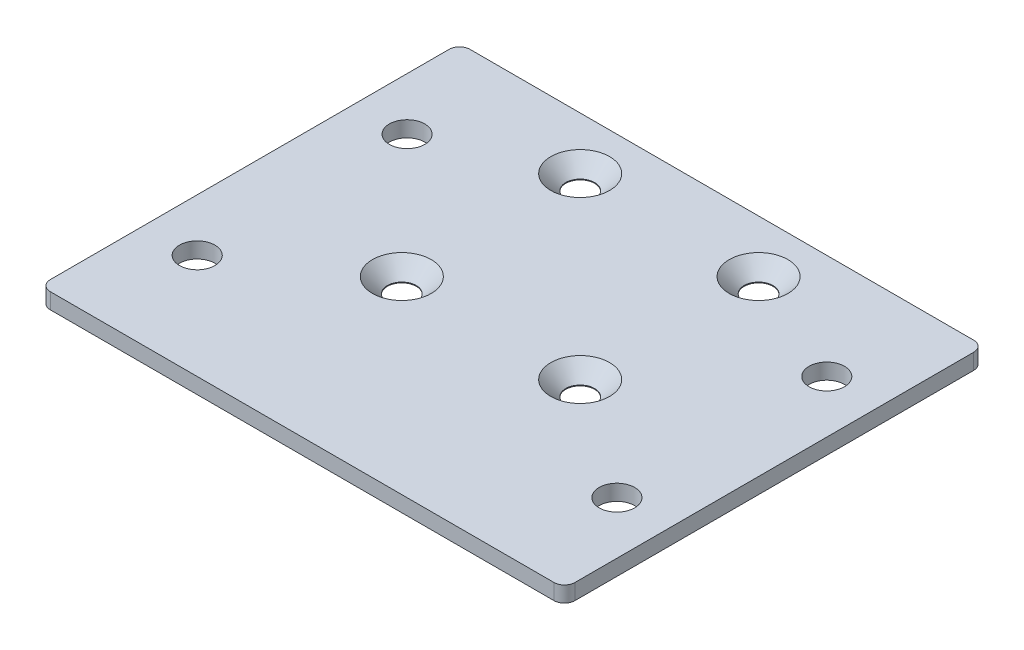
ISO-10303-21;
HEADER;
FILE_DESCRIPTION(('STEP AP214'),'2;1');
FILE_NAME('part.step','',(''),(''),'','','');
FILE_SCHEMA(('AUTOMOTIVE_DESIGN { 1 0 10303 214 1 1 1 1 }'));
ENDSEC;
DATA;
#1=APPLICATION_CONTEXT('core data for automotive mechanical design processes');
#2=APPLICATION_PROTOCOL_DEFINITION('international standard','automotive_design',2000,#1);
#3=PRODUCT_CONTEXT('',#1,'mechanical');
#4=PRODUCT('Part','Part','',(#3));
#5=PRODUCT_RELATED_PRODUCT_CATEGORY('part','',(#4));
#6=PRODUCT_DEFINITION_FORMATION('','',#4);
#7=PRODUCT_DEFINITION_CONTEXT('part definition',#1,'design');
#8=PRODUCT_DEFINITION('design','',#6,#7);
#9=PRODUCT_DEFINITION_SHAPE('','',#8);
#10=(LENGTH_UNIT() NAMED_UNIT(*) SI_UNIT(.MILLI.,.METRE.));
#11=(NAMED_UNIT(*) PLANE_ANGLE_UNIT() SI_UNIT($,.RADIAN.));
#12=(NAMED_UNIT(*) SI_UNIT($,.STERADIAN.) SOLID_ANGLE_UNIT());
#13=UNCERTAINTY_MEASURE_WITH_UNIT(LENGTH_MEASURE(1.E-05),#10,'distance_accuracy_value','');
#14=(GEOMETRIC_REPRESENTATION_CONTEXT(3) GLOBAL_UNCERTAINTY_ASSIGNED_CONTEXT((#13)) GLOBAL_UNIT_ASSIGNED_CONTEXT((#10,
#11,#12)) REPRESENTATION_CONTEXT('',''));
#15=CARTESIAN_POINT('',(0.,0.,0.));
#16=DIRECTION('',(0.,0.,1.));
#17=DIRECTION('',(1.,0.,0.));
#18=AXIS2_PLACEMENT_3D('',#15,#16,#17);
#19=CARTESIAN_POINT('',(-149.777777777778,-3.,-34.4444444444445));
#20=DIRECTION('',(-1.,0.,0.));
#21=DIRECTION('',(0.,0.,1.));
#22=AXIS2_PLACEMENT_3D('',#19,#20,#21);
#23=PLANE('',#22);
#24=DIRECTION('',(0.,0.,1.));
#25=VECTOR('',#24,1.);
#26=CARTESIAN_POINT('',(-149.777777777778,0.,-34.4444444444445));
#27=LINE('',#26,#25);
#28=CARTESIAN_POINT('',(-149.777777777778,0.,-32.4444444444445));
#29=VERTEX_POINT('',#28);
#30=CARTESIAN_POINT('',(-149.777777777778,0.,43.5555555555555));
#31=VERTEX_POINT('',#30);
#32=EDGE_CURVE('E166',#29,#31,#27,.T.);
#33=ORIENTED_EDGE('',*,*,#32,.F.);
#34=DIRECTION('',(0.,1.,0.));
#35=VECTOR('',#34,1.);
#36=CARTESIAN_POINT('',(-149.777777777778,-3.,-32.4444444444445));
#37=LINE('',#36,#35);
#38=CARTESIAN_POINT('',(-149.777777777778,-3.,-32.4444444444445));
#39=VERTEX_POINT('',#38);
#40=EDGE_CURVE('E146',#29,#39,#37,.F.);
#41=ORIENTED_EDGE('',*,*,#40,.T.);
#42=DIRECTION('',(0.,0.,1.));
#43=VECTOR('',#42,1.);
#44=CARTESIAN_POINT('',(-149.777777777778,-3.,-34.4444444444445));
#45=LINE('',#44,#43);
#46=CARTESIAN_POINT('',(-149.777777777778,-3.,43.5555555555555));
#47=VERTEX_POINT('',#46);
#48=EDGE_CURVE('E127',#39,#47,#45,.T.);
#49=ORIENTED_EDGE('',*,*,#48,.T.);
#50=DIRECTION('',(0.,1.,0.));
#51=VECTOR('',#50,1.);
#52=CARTESIAN_POINT('',(-149.777777777778,-3.,43.5555555555555));
#53=LINE('',#52,#51);
#54=EDGE_CURVE('E143',#47,#31,#53,.T.);
#55=ORIENTED_EDGE('',*,*,#54,.T.);
#56=EDGE_LOOP('',(#33,#41,#49,#55));
#57=FACE_BOUND('',#56,.T.);
#58=ADVANCED_FACE('F40',(#57),#23,.T.);
#59=CARTESIAN_POINT('',(-149.777777777778,-3.,-34.4444444444445));
#60=DIRECTION('',(0.,0.,-1.));
#61=DIRECTION('',(-1.,0.,0.));
#62=AXIS2_PLACEMENT_3D('',#59,#60,#61);
#63=PLANE('',#62);
#64=DIRECTION('',(-1.,0.,0.));
#65=VECTOR('',#64,1.);
#66=CARTESIAN_POINT('',(-149.777777777778,-3.,-34.4444444444445));
#67=LINE('',#66,#65);
#68=CARTESIAN_POINT('',(-51.7777777777778,-3.,-34.4444444444445));
#69=VERTEX_POINT('',#68);
#70=CARTESIAN_POINT('',(-147.777777777778,-3.,-34.4444444444445));
#71=VERTEX_POINT('',#70);
#72=EDGE_CURVE('E132',#69,#71,#67,.T.);
#73=ORIENTED_EDGE('',*,*,#72,.T.);
#74=DIRECTION('',(0.,1.,0.));
#75=VECTOR('',#74,1.);
#76=CARTESIAN_POINT('',(-147.777777777778,-3.,-34.4444444444445));
#77=LINE('',#76,#75);
#78=CARTESIAN_POINT('',(-147.777777777778,0.,-34.4444444444445));
#79=VERTEX_POINT('',#78);
#80=EDGE_CURVE('E126',#71,#79,#77,.T.);
#81=ORIENTED_EDGE('',*,*,#80,.T.);
#82=DIRECTION('',(-1.,0.,0.));
#83=VECTOR('',#82,1.);
#84=CARTESIAN_POINT('',(-149.777777777778,0.,-34.4444444444445));
#85=LINE('',#84,#83);
#86=CARTESIAN_POINT('',(-51.7777777777778,0.,-34.4444444444445));
#87=VERTEX_POINT('',#86);
#88=EDGE_CURVE('E109',#87,#79,#85,.T.);
#89=ORIENTED_EDGE('',*,*,#88,.F.);
#90=DIRECTION('',(0.,1.,0.));
#91=VECTOR('',#90,1.);
#92=CARTESIAN_POINT('',(-51.7777777777778,-3.,-34.4444444444445));
#93=LINE('',#92,#91);
#94=EDGE_CURVE('E123',#87,#69,#93,.F.);
#95=ORIENTED_EDGE('',*,*,#94,.T.);
#96=EDGE_LOOP('',(#73,#81,#89,#95));
#97=FACE_BOUND('',#96,.T.);
#98=ADVANCED_FACE('F122',(#97),#63,.T.);
#99=CARTESIAN_POINT('',(-49.7777777777778,-3.,-34.4444444444445));
#100=DIRECTION('',(1.,0.,0.));
#101=DIRECTION('',(0.,0.,-1.));
#102=AXIS2_PLACEMENT_3D('',#99,#100,#101);
#103=PLANE('',#102);
#104=DIRECTION('',(0.,0.,-1.));
#105=VECTOR('',#104,1.);
#106=CARTESIAN_POINT('',(-49.7777777777778,-3.,-34.4444444444445));
#107=LINE('',#106,#105);
#108=CARTESIAN_POINT('',(-49.7777777777777,-3.,43.5555555555555));
#109=VERTEX_POINT('',#108);
#110=CARTESIAN_POINT('',(-49.7777777777778,-3.,-32.4444444444445));
#111=VERTEX_POINT('',#110);
#112=EDGE_CURVE('E136',#109,#111,#107,.T.);
#113=ORIENTED_EDGE('',*,*,#112,.T.);
#114=DIRECTION('',(0.,1.,0.));
#115=VECTOR('',#114,1.);
#116=CARTESIAN_POINT('',(-49.7777777777778,-3.,-32.4444444444445));
#117=LINE('',#116,#115);
#118=CARTESIAN_POINT('',(-49.7777777777778,0.,-32.4444444444445));
#119=VERTEX_POINT('',#118);
#120=EDGE_CURVE('E156',#111,#119,#117,.T.);
#121=ORIENTED_EDGE('',*,*,#120,.T.);
#122=DIRECTION('',(0.,0.,-1.));
#123=VECTOR('',#122,1.);
#124=CARTESIAN_POINT('',(-49.7777777777778,0.,-34.4444444444445));
#125=LINE('',#124,#123);
#126=CARTESIAN_POINT('',(-49.7777777777777,0.,43.5555555555555));
#127=VERTEX_POINT('',#126);
#128=EDGE_CURVE('E111',#127,#119,#125,.T.);
#129=ORIENTED_EDGE('',*,*,#128,.F.);
#130=DIRECTION('',(0.,1.,0.));
#131=VECTOR('',#130,1.);
#132=CARTESIAN_POINT('',(-49.7777777777777,-3.,43.5555555555555));
#133=LINE('',#132,#131);
#134=EDGE_CURVE('E154',#127,#109,#133,.F.);
#135=ORIENTED_EDGE('',*,*,#134,.T.);
#136=EDGE_LOOP('',(#113,#121,#129,#135));
#137=FACE_BOUND('',#136,.T.);
#138=ADVANCED_FACE('F159',(#137),#103,.T.);
#139=CARTESIAN_POINT('',(-149.777777777778,-3.,45.5555555555555));
#140=DIRECTION('',(0.,0.,1.));
#141=DIRECTION('',(1.,0.,0.));
#142=AXIS2_PLACEMENT_3D('',#139,#140,#141);
#143=PLANE('',#142);
#144=DIRECTION('',(1.,0.,0.));
#145=VECTOR('',#144,1.);
#146=CARTESIAN_POINT('',(-149.777777777778,-3.,45.5555555555555));
#147=LINE('',#146,#145);
#148=CARTESIAN_POINT('',(-147.777777777778,-3.,45.5555555555555));
#149=VERTEX_POINT('',#148);
#150=CARTESIAN_POINT('',(-51.7777777777777,-3.,45.5555555555555));
#151=VERTEX_POINT('',#150);
#152=EDGE_CURVE('E161',#149,#151,#147,.T.);
#153=ORIENTED_EDGE('',*,*,#152,.T.);
#154=DIRECTION('',(0.,1.,0.));
#155=VECTOR('',#154,1.);
#156=CARTESIAN_POINT('',(-51.7777777777777,-3.,45.5555555555555));
#157=LINE('',#156,#155);
#158=CARTESIAN_POINT('',(-51.7777777777777,0.,45.5555555555555));
#159=VERTEX_POINT('',#158);
#160=EDGE_CURVE('E11',#151,#159,#157,.T.);
#161=ORIENTED_EDGE('',*,*,#160,.T.);
#162=DIRECTION('',(1.,0.,0.));
#163=VECTOR('',#162,1.);
#164=CARTESIAN_POINT('',(-149.777777777778,0.,45.5555555555555));
#165=LINE('',#164,#163);
#166=CARTESIAN_POINT('',(-147.777777777778,0.,45.5555555555555));
#167=VERTEX_POINT('',#166);
#168=EDGE_CURVE('E169',#167,#159,#165,.T.);
#169=ORIENTED_EDGE('',*,*,#168,.F.);
#170=DIRECTION('',(0.,1.,0.));
#171=VECTOR('',#170,1.);
#172=CARTESIAN_POINT('',(-147.777777777778,-3.,45.5555555555555));
#173=LINE('',#172,#171);
#174=EDGE_CURVE('E48',#167,#149,#173,.F.);
#175=ORIENTED_EDGE('',*,*,#174,.T.);
#176=EDGE_LOOP('',(#153,#161,#169,#175));
#177=FACE_BOUND('',#176,.T.);
#178=ADVANCED_FACE('F172',(#177),#143,.T.);
#179=CARTESIAN_POINT('',(0.,-3.,0.));
#180=DIRECTION('',(0.,1.,0.));
#181=DIRECTION('',(0.,0.,1.));
#182=AXIS2_PLACEMENT_3D('',#179,#180,#181);
#183=PLANE('',#182);
#184=CARTESIAN_POINT('',(-116.777777777778,-3.,-24.4444444444445));
#185=DIRECTION('',(0.,1.,0.));
#186=DIRECTION('',(0.,0.,1.));
#187=AXIS2_PLACEMENT_3D('',#184,#185,#186);
#188=CIRCLE('',#187,2.75);
#189=CARTESIAN_POINT('',(-116.777777777778,-3.,-21.6944444444445));
#190=VERTEX_POINT('',#189);
#191=EDGE_CURVE('E235',#190,#190,#188,.T.);
#192=ORIENTED_EDGE('',*,*,#191,.T.);
#193=EDGE_LOOP('',(#192));
#194=FACE_BOUND('',#193,.T.);
#195=CARTESIAN_POINT('',(-82.7777777777778,-3.,-24.4444444444445));
#196=DIRECTION('',(0.,1.,0.));
#197=DIRECTION('',(0.,0.,1.));
#198=AXIS2_PLACEMENT_3D('',#195,#196,#197);
#199=CIRCLE('',#198,2.75);
#200=CARTESIAN_POINT('',(-82.7777777777778,-3.,-21.6944444444445));
#201=VERTEX_POINT('',#200);
#202=EDGE_CURVE('E226',#201,#201,#199,.T.);
#203=ORIENTED_EDGE('',*,*,#202,.T.);
#204=EDGE_LOOP('',(#203));
#205=FACE_BOUND('',#204,.T.);
#206=CARTESIAN_POINT('',(-82.7777777777778,-3.,9.55555555555555));
#207=DIRECTION('',(0.,1.,0.));
#208=DIRECTION('',(0.,0.,1.));
#209=AXIS2_PLACEMENT_3D('',#206,#207,#208);
#210=CIRCLE('',#209,2.75);
#211=CARTESIAN_POINT('',(-82.7777777777778,-3.,12.3055555555555));
#212=VERTEX_POINT('',#211);
#213=EDGE_CURVE('E217',#212,#212,#210,.T.);
#214=ORIENTED_EDGE('',*,*,#213,.T.);
#215=EDGE_LOOP('',(#214));
#216=FACE_BOUND('',#215,.T.);
#217=CARTESIAN_POINT('',(-116.777777777778,-3.,9.55555555555555));
#218=DIRECTION('',(0.,1.,0.));
#219=DIRECTION('',(0.,0.,1.));
#220=AXIS2_PLACEMENT_3D('',#217,#218,#219);
#221=CIRCLE('',#220,2.75);
#222=CARTESIAN_POINT('',(-116.777777777778,-3.,12.3055555555555));
#223=VERTEX_POINT('',#222);
#224=EDGE_CURVE('E208',#223,#223,#221,.T.);
#225=ORIENTED_EDGE('',*,*,#224,.T.);
#226=EDGE_LOOP('',(#225));
#227=FACE_BOUND('',#226,.T.);
#228=CARTESIAN_POINT('',(-139.777777777778,-3.,25.5555555555555));
#229=DIRECTION('',(0.,1.,0.));
#230=DIRECTION('',(0.,0.,1.));
#231=AXIS2_PLACEMENT_3D('',#228,#229,#230);
#232=CIRCLE('',#231,3.3782);
#233=CARTESIAN_POINT('',(-139.777777777778,-3.,28.9337555555555));
#234=VERTEX_POINT('',#233);
#235=EDGE_CURVE('E202',#234,#234,#232,.T.);
#236=ORIENTED_EDGE('',*,*,#235,.T.);
#237=EDGE_LOOP('',(#236));
#238=FACE_BOUND('',#237,.T.);
#239=CARTESIAN_POINT('',(-59.7777777777778,-3.,25.5555555555555));
#240=DIRECTION('',(0.,1.,0.));
#241=DIRECTION('',(0.,0.,1.));
#242=AXIS2_PLACEMENT_3D('',#239,#240,#241);
#243=CIRCLE('',#242,3.3782);
#244=CARTESIAN_POINT('',(-59.7777777777778,-3.,28.9337555555555));
#245=VERTEX_POINT('',#244);
#246=EDGE_CURVE('E196',#245,#245,#243,.T.);
#247=ORIENTED_EDGE('',*,*,#246,.T.);
#248=EDGE_LOOP('',(#247));
#249=FACE_BOUND('',#248,.T.);
#250=CARTESIAN_POINT('',(-139.777777777778,-3.,-14.4444444444445));
#251=DIRECTION('',(0.,1.,0.));
#252=DIRECTION('',(0.,0.,1.));
#253=AXIS2_PLACEMENT_3D('',#250,#251,#252);
#254=CIRCLE('',#253,3.3782);
#255=CARTESIAN_POINT('',(-139.777777777778,-3.,-11.0662444444445));
#256=VERTEX_POINT('',#255);
#257=EDGE_CURVE('E190',#256,#256,#254,.T.);
#258=ORIENTED_EDGE('',*,*,#257,.T.);
#259=EDGE_LOOP('',(#258));
#260=FACE_BOUND('',#259,.T.);
#261=CARTESIAN_POINT('',(-59.7777777777778,-3.,-14.4444444444445));
#262=DIRECTION('',(0.,1.,0.));
#263=DIRECTION('',(0.,0.,1.));
#264=AXIS2_PLACEMENT_3D('',#261,#262,#263);
#265=CIRCLE('',#264,3.3782);
#266=CARTESIAN_POINT('',(-59.7777777777778,-3.,-11.0662444444445));
#267=VERTEX_POINT('',#266);
#268=EDGE_CURVE('E170',#267,#267,#265,.T.);
#269=ORIENTED_EDGE('',*,*,#268,.T.);
#270=EDGE_LOOP('',(#269));
#271=FACE_BOUND('',#270,.T.);
#272=ORIENTED_EDGE('',*,*,#48,.F.);
#273=CARTESIAN_POINT('',(-147.777777777778,-3.,-32.4444444444445));
#274=DIRECTION('',(0.,1.,0.));
#275=DIRECTION('',(0.,0.,1.));
#276=AXIS2_PLACEMENT_3D('',#273,#274,#275);
#277=CIRCLE('',#276,2.);
#278=EDGE_CURVE('E152',#39,#71,#277,.F.);
#279=ORIENTED_EDGE('',*,*,#278,.T.);
#280=ORIENTED_EDGE('',*,*,#72,.F.);
#281=CARTESIAN_POINT('',(-51.7777777777778,-3.,-32.4444444444445));
#282=DIRECTION('',(0.,1.,0.));
#283=DIRECTION('',(0.,0.,1.));
#284=AXIS2_PLACEMENT_3D('',#281,#282,#283);
#285=CIRCLE('',#284,2.);
#286=EDGE_CURVE('E131',#69,#111,#285,.F.);
#287=ORIENTED_EDGE('',*,*,#286,.T.);
#288=ORIENTED_EDGE('',*,*,#112,.F.);
#289=CARTESIAN_POINT('',(-51.7777777777777,-3.,43.5555555555555));
#290=DIRECTION('',(0.,1.,0.));
#291=DIRECTION('',(0.,0.,1.));
#292=AXIS2_PLACEMENT_3D('',#289,#290,#291);
#293=CIRCLE('',#292,2.);
#294=EDGE_CURVE('E55',#109,#151,#293,.F.);
#295=ORIENTED_EDGE('',*,*,#294,.T.);
#296=ORIENTED_EDGE('',*,*,#152,.F.);
#297=CARTESIAN_POINT('',(-147.777777777778,-3.,43.5555555555555));
#298=DIRECTION('',(0.,1.,0.));
#299=DIRECTION('',(0.,0.,1.));
#300=AXIS2_PLACEMENT_3D('',#297,#298,#299);
#301=CIRCLE('',#300,2.);
#302=EDGE_CURVE('E148',#149,#47,#301,.F.);
#303=ORIENTED_EDGE('',*,*,#302,.T.);
#304=EDGE_LOOP('',(#272,#279,#280,#287,#288,#295,#296,#303));
#305=FACE_BOUND('',#304,.T.);
#306=ADVANCED_FACE('F179',(#194,#205,#216,#227,#238,#249,#260,#271,#305),#183,.F.);
#307=CARTESIAN_POINT('',(0.,0.,0.));
#308=DIRECTION('',(0.,1.,0.));
#309=DIRECTION('',(0.,0.,1.));
#310=AXIS2_PLACEMENT_3D('',#307,#308,#309);
#311=PLANE('',#310);
#312=CARTESIAN_POINT('',(-116.777777777778,0.,-24.4444444444445));
#313=DIRECTION('',(0.,1.,0.));
#314=DIRECTION('',(0.,0.,1.));
#315=AXIS2_PLACEMENT_3D('',#312,#313,#314);
#316=CIRCLE('',#315,5.59999999999999);
#317=CARTESIAN_POINT('',(-116.777777777778,0.,-18.8444444444445));
#318=VERTEX_POINT('',#317);
#319=EDGE_CURVE('E241',#318,#318,#316,.T.);
#320=ORIENTED_EDGE('',*,*,#319,.F.);
#321=EDGE_LOOP('',(#320));
#322=FACE_BOUND('',#321,.T.);
#323=CARTESIAN_POINT('',(-82.7777777777778,0.,-24.4444444444445));
#324=DIRECTION('',(0.,1.,0.));
#325=DIRECTION('',(0.,0.,1.));
#326=AXIS2_PLACEMENT_3D('',#323,#324,#325);
#327=CIRCLE('',#326,5.59999999999999);
#328=CARTESIAN_POINT('',(-82.7777777777778,0.,-18.8444444444445));
#329=VERTEX_POINT('',#328);
#330=EDGE_CURVE('E232',#329,#329,#327,.T.);
#331=ORIENTED_EDGE('',*,*,#330,.F.);
#332=EDGE_LOOP('',(#331));
#333=FACE_BOUND('',#332,.T.);
#334=CARTESIAN_POINT('',(-82.7777777777778,0.,9.55555555555555));
#335=DIRECTION('',(0.,1.,0.));
#336=DIRECTION('',(0.,0.,1.));
#337=AXIS2_PLACEMENT_3D('',#334,#335,#336);
#338=CIRCLE('',#337,5.59999999999999);
#339=CARTESIAN_POINT('',(-82.7777777777778,0.,15.1555555555555));
#340=VERTEX_POINT('',#339);
#341=EDGE_CURVE('E223',#340,#340,#338,.T.);
#342=ORIENTED_EDGE('',*,*,#341,.F.);
#343=EDGE_LOOP('',(#342));
#344=FACE_BOUND('',#343,.T.);
#345=CARTESIAN_POINT('',(-116.777777777778,0.,9.55555555555555));
#346=DIRECTION('',(0.,1.,0.));
#347=DIRECTION('',(0.,0.,1.));
#348=AXIS2_PLACEMENT_3D('',#345,#346,#347);
#349=CIRCLE('',#348,5.59999999999999);
#350=CARTESIAN_POINT('',(-116.777777777778,0.,15.1555555555555));
#351=VERTEX_POINT('',#350);
#352=EDGE_CURVE('E214',#351,#351,#349,.T.);
#353=ORIENTED_EDGE('',*,*,#352,.F.);
#354=EDGE_LOOP('',(#353));
#355=FACE_BOUND('',#354,.T.);
#356=CARTESIAN_POINT('',(-139.777777777778,0.,25.5555555555555));
#357=DIRECTION('',(0.,1.,0.));
#358=DIRECTION('',(0.,0.,1.));
#359=AXIS2_PLACEMENT_3D('',#356,#357,#358);
#360=CIRCLE('',#359,3.3782);
#361=CARTESIAN_POINT('',(-139.777777777778,0.,28.9337555555555));
#362=VERTEX_POINT('',#361);
#363=EDGE_CURVE('E205',#362,#362,#360,.T.);
#364=ORIENTED_EDGE('',*,*,#363,.F.);
#365=EDGE_LOOP('',(#364));
#366=FACE_BOUND('',#365,.T.);
#367=CARTESIAN_POINT('',(-59.7777777777778,0.,25.5555555555555));
#368=DIRECTION('',(0.,1.,0.));
#369=DIRECTION('',(0.,0.,1.));
#370=AXIS2_PLACEMENT_3D('',#367,#368,#369);
#371=CIRCLE('',#370,3.3782);
#372=CARTESIAN_POINT('',(-59.7777777777778,0.,28.9337555555555));
#373=VERTEX_POINT('',#372);
#374=EDGE_CURVE('E199',#373,#373,#371,.T.);
#375=ORIENTED_EDGE('',*,*,#374,.F.);
#376=EDGE_LOOP('',(#375));
#377=FACE_BOUND('',#376,.T.);
#378=CARTESIAN_POINT('',(-139.777777777778,0.,-14.4444444444445));
#379=DIRECTION('',(0.,1.,0.));
#380=DIRECTION('',(0.,0.,1.));
#381=AXIS2_PLACEMENT_3D('',#378,#379,#380);
#382=CIRCLE('',#381,3.3782);
#383=CARTESIAN_POINT('',(-139.777777777778,0.,-11.0662444444445));
#384=VERTEX_POINT('',#383);
#385=EDGE_CURVE('E193',#384,#384,#382,.T.);
#386=ORIENTED_EDGE('',*,*,#385,.F.);
#387=EDGE_LOOP('',(#386));
#388=FACE_BOUND('',#387,.T.);
#389=CARTESIAN_POINT('',(-59.7777777777778,0.,-14.4444444444445));
#390=DIRECTION('',(0.,1.,0.));
#391=DIRECTION('',(0.,0.,1.));
#392=AXIS2_PLACEMENT_3D('',#389,#390,#391);
#393=CIRCLE('',#392,3.3782);
#394=CARTESIAN_POINT('',(-59.7777777777778,0.,-11.0662444444445));
#395=VERTEX_POINT('',#394);
#396=EDGE_CURVE('E187',#395,#395,#393,.T.);
#397=ORIENTED_EDGE('',*,*,#396,.F.);
#398=EDGE_LOOP('',(#397));
#399=FACE_BOUND('',#398,.T.);
#400=ORIENTED_EDGE('',*,*,#88,.T.);
#401=CARTESIAN_POINT('',(-147.777777777778,0.,-32.4444444444445));
#402=DIRECTION('',(0.,1.,0.));
#403=DIRECTION('',(0.,0.,1.));
#404=AXIS2_PLACEMENT_3D('',#401,#402,#403);
#405=CIRCLE('',#404,2.);
#406=EDGE_CURVE('E116',#79,#29,#405,.T.);
#407=ORIENTED_EDGE('',*,*,#406,.T.);
#408=ORIENTED_EDGE('',*,*,#32,.T.);
#409=CARTESIAN_POINT('',(-147.777777777778,0.,43.5555555555555));
#410=DIRECTION('',(0.,1.,0.));
#411=DIRECTION('',(0.,0.,1.));
#412=AXIS2_PLACEMENT_3D('',#409,#410,#411);
#413=CIRCLE('',#412,2.);
#414=EDGE_CURVE('E134',#31,#167,#413,.T.);
#415=ORIENTED_EDGE('',*,*,#414,.T.);
#416=ORIENTED_EDGE('',*,*,#168,.T.);
#417=CARTESIAN_POINT('',(-51.7777777777777,0.,43.5555555555555));
#418=DIRECTION('',(0.,1.,0.));
#419=DIRECTION('',(0.,0.,1.));
#420=AXIS2_PLACEMENT_3D('',#417,#418,#419);
#421=CIRCLE('',#420,2.);
#422=EDGE_CURVE('E117',#159,#127,#421,.T.);
#423=ORIENTED_EDGE('',*,*,#422,.T.);
#424=ORIENTED_EDGE('',*,*,#128,.T.);
#425=CARTESIAN_POINT('',(-51.7777777777778,0.,-32.4444444444445));
#426=DIRECTION('',(0.,1.,0.));
#427=DIRECTION('',(0.,0.,1.));
#428=AXIS2_PLACEMENT_3D('',#425,#426,#427);
#429=CIRCLE('',#428,2.);
#430=EDGE_CURVE('E106',#119,#87,#429,.T.);
#431=ORIENTED_EDGE('',*,*,#430,.T.);
#432=EDGE_LOOP('',(#400,#407,#408,#415,#416,#423,#424,#431));
#433=FACE_BOUND('',#432,.T.);
#434=ADVANCED_FACE('F108',(#322,#333,#344,#355,#366,#377,#388,#399,#433),#311,.T.);
#435=CARTESIAN_POINT('',(-147.777777777778,-3.,-32.4444444444445));
#436=DIRECTION('',(0.,1.,0.));
#437=DIRECTION('',(0.,0.,1.));
#438=AXIS2_PLACEMENT_3D('',#435,#436,#437);
#439=CYLINDRICAL_SURFACE('',#438,2.);
#440=ORIENTED_EDGE('',*,*,#278,.F.);
#441=ORIENTED_EDGE('',*,*,#40,.F.);
#442=ORIENTED_EDGE('',*,*,#406,.F.);
#443=ORIENTED_EDGE('',*,*,#80,.F.);
#444=EDGE_LOOP('',(#440,#441,#442,#443));
#445=FACE_BOUND('',#444,.T.);
#446=ADVANCED_FACE('F249',(#445),#439,.T.);
#447=CARTESIAN_POINT('',(-51.7777777777778,-3.,-32.4444444444445));
#448=DIRECTION('',(0.,1.,0.));
#449=DIRECTION('',(0.,0.,1.));
#450=AXIS2_PLACEMENT_3D('',#447,#448,#449);
#451=CYLINDRICAL_SURFACE('',#450,2.);
#452=ORIENTED_EDGE('',*,*,#286,.F.);
#453=ORIENTED_EDGE('',*,*,#94,.F.);
#454=ORIENTED_EDGE('',*,*,#430,.F.);
#455=ORIENTED_EDGE('',*,*,#120,.F.);
#456=EDGE_LOOP('',(#452,#453,#454,#455));
#457=FACE_BOUND('',#456,.T.);
#458=ADVANCED_FACE('F130',(#457),#451,.T.);
#459=CARTESIAN_POINT('',(-51.7777777777777,-3.,43.5555555555555));
#460=DIRECTION('',(0.,1.,0.));
#461=DIRECTION('',(0.,0.,1.));
#462=AXIS2_PLACEMENT_3D('',#459,#460,#461);
#463=CYLINDRICAL_SURFACE('',#462,2.);
#464=ORIENTED_EDGE('',*,*,#294,.F.);
#465=ORIENTED_EDGE('',*,*,#134,.F.);
#466=ORIENTED_EDGE('',*,*,#422,.F.);
#467=ORIENTED_EDGE('',*,*,#160,.F.);
#468=EDGE_LOOP('',(#464,#465,#466,#467));
#469=FACE_BOUND('',#468,.T.);
#470=ADVANCED_FACE('F277',(#469),#463,.T.);
#471=CARTESIAN_POINT('',(-147.777777777778,-3.,43.5555555555555));
#472=DIRECTION('',(0.,1.,0.));
#473=DIRECTION('',(0.,0.,1.));
#474=AXIS2_PLACEMENT_3D('',#471,#472,#473);
#475=CYLINDRICAL_SURFACE('',#474,2.);
#476=ORIENTED_EDGE('',*,*,#302,.F.);
#477=ORIENTED_EDGE('',*,*,#174,.F.);
#478=ORIENTED_EDGE('',*,*,#414,.F.);
#479=ORIENTED_EDGE('',*,*,#54,.F.);
#480=EDGE_LOOP('',(#476,#477,#478,#479));
#481=FACE_BOUND('',#480,.T.);
#482=ADVANCED_FACE('F42',(#481),#475,.T.);
#483=CARTESIAN_POINT('',(-59.7777777777778,0.,-14.4444444444445));
#484=DIRECTION('',(0.,1.,0.));
#485=DIRECTION('',(0.,0.,1.));
#486=AXIS2_PLACEMENT_3D('',#483,#484,#485);
#487=CYLINDRICAL_SURFACE('',#486,3.3782);
#488=ORIENTED_EDGE('',*,*,#268,.F.);
#489=EDGE_LOOP('',(#488));
#490=FACE_BOUND('',#489,.T.);
#491=ORIENTED_EDGE('',*,*,#396,.T.);
#492=EDGE_LOOP('',(#491));
#493=FACE_BOUND('',#492,.T.);
#494=ADVANCED_FACE('F265',(#490,#493),#487,.F.);
#495=CARTESIAN_POINT('',(-139.777777777778,0.,-14.4444444444445));
#496=DIRECTION('',(0.,1.,0.));
#497=DIRECTION('',(0.,0.,1.));
#498=AXIS2_PLACEMENT_3D('',#495,#496,#497);
#499=CYLINDRICAL_SURFACE('',#498,3.3782);
#500=ORIENTED_EDGE('',*,*,#257,.F.);
#501=EDGE_LOOP('',(#500));
#502=FACE_BOUND('',#501,.T.);
#503=ORIENTED_EDGE('',*,*,#385,.T.);
#504=EDGE_LOOP('',(#503));
#505=FACE_BOUND('',#504,.T.);
#506=ADVANCED_FACE('F267',(#502,#505),#499,.F.);
#507=CARTESIAN_POINT('',(-59.7777777777778,0.,25.5555555555555));
#508=DIRECTION('',(0.,1.,0.));
#509=DIRECTION('',(0.,0.,1.));
#510=AXIS2_PLACEMENT_3D('',#507,#508,#509);
#511=CYLINDRICAL_SURFACE('',#510,3.3782);
#512=ORIENTED_EDGE('',*,*,#246,.F.);
#513=EDGE_LOOP('',(#512));
#514=FACE_BOUND('',#513,.T.);
#515=ORIENTED_EDGE('',*,*,#374,.T.);
#516=EDGE_LOOP('',(#515));
#517=FACE_BOUND('',#516,.T.);
#518=ADVANCED_FACE('F274',(#514,#517),#511,.F.);
#519=CARTESIAN_POINT('',(-139.777777777778,0.,25.5555555555555));
#520=DIRECTION('',(0.,1.,0.));
#521=DIRECTION('',(0.,0.,1.));
#522=AXIS2_PLACEMENT_3D('',#519,#520,#521);
#523=CYLINDRICAL_SURFACE('',#522,3.3782);
#524=ORIENTED_EDGE('',*,*,#235,.F.);
#525=EDGE_LOOP('',(#524));
#526=FACE_BOUND('',#525,.T.);
#527=ORIENTED_EDGE('',*,*,#363,.T.);
#528=EDGE_LOOP('',(#527));
#529=FACE_BOUND('',#528,.T.);
#530=ADVANCED_FACE('F322',(#526,#529),#523,.F.);
#531=CARTESIAN_POINT('',(-116.777777777778,0.,9.55555555555555));
#532=DIRECTION('',(0.,1.,0.));
#533=DIRECTION('',(0.,0.,1.));
#534=AXIS2_PLACEMENT_3D('',#531,#532,#533);
#535=CYLINDRICAL_SURFACE('',#534,2.75);
#536=ORIENTED_EDGE('',*,*,#224,.F.);
#537=EDGE_LOOP('',(#536));
#538=FACE_BOUND('',#537,.T.);
#539=CARTESIAN_POINT('',(-116.777777777778,-2.85,9.55555555555555));
#540=DIRECTION('',(0.,1.,0.));
#541=DIRECTION('',(0.,0.,1.));
#542=AXIS2_PLACEMENT_3D('',#539,#540,#541);
#543=CIRCLE('',#542,2.75);
#544=CARTESIAN_POINT('',(-116.777777777778,-2.85,12.3055555555555));
#545=VERTEX_POINT('',#544);
#546=EDGE_CURVE('E211',#545,#545,#543,.T.);
#547=ORIENTED_EDGE('',*,*,#546,.T.);
#548=EDGE_LOOP('',(#547));
#549=FACE_BOUND('',#548,.T.);
#550=ADVANCED_FACE('F332',(#538,#549),#535,.F.);
#551=CARTESIAN_POINT('',(-116.777777777778,0.,9.55555555555555));
#552=DIRECTION('',(0.,1.,0.));
#553=DIRECTION('',(0.,0.,1.));
#554=AXIS2_PLACEMENT_3D('',#551,#552,#553);
#555=CONICAL_SURFACE('',#554,5.59999999999999,0.785398163397447);
#556=ORIENTED_EDGE('',*,*,#546,.F.);
#557=EDGE_LOOP('',(#556));
#558=FACE_BOUND('',#557,.T.);
#559=ORIENTED_EDGE('',*,*,#352,.T.);
#560=EDGE_LOOP('',(#559));
#561=FACE_BOUND('',#560,.T.);
#562=ADVANCED_FACE('F361',(#558,#561),#555,.F.);
#563=CARTESIAN_POINT('',(-82.7777777777778,0.,9.55555555555555));
#564=DIRECTION('',(0.,1.,0.));
#565=DIRECTION('',(0.,0.,1.));
#566=AXIS2_PLACEMENT_3D('',#563,#564,#565);
#567=CYLINDRICAL_SURFACE('',#566,2.75);
#568=ORIENTED_EDGE('',*,*,#213,.F.);
#569=EDGE_LOOP('',(#568));
#570=FACE_BOUND('',#569,.T.);
#571=CARTESIAN_POINT('',(-82.7777777777778,-2.85,9.55555555555555));
#572=DIRECTION('',(0.,1.,0.));
#573=DIRECTION('',(0.,0.,1.));
#574=AXIS2_PLACEMENT_3D('',#571,#572,#573);
#575=CIRCLE('',#574,2.75);
#576=CARTESIAN_POINT('',(-82.7777777777778,-2.85,12.3055555555555));
#577=VERTEX_POINT('',#576);
#578=EDGE_CURVE('E220',#577,#577,#575,.T.);
#579=ORIENTED_EDGE('',*,*,#578,.T.);
#580=EDGE_LOOP('',(#579));
#581=FACE_BOUND('',#580,.T.);
#582=ADVANCED_FACE('F371',(#570,#581),#567,.F.);
#583=CARTESIAN_POINT('',(-82.7777777777778,0.,9.55555555555555));
#584=DIRECTION('',(0.,1.,0.));
#585=DIRECTION('',(0.,0.,1.));
#586=AXIS2_PLACEMENT_3D('',#583,#584,#585);
#587=CONICAL_SURFACE('',#586,5.59999999999999,0.785398163397447);
#588=ORIENTED_EDGE('',*,*,#578,.F.);
#589=EDGE_LOOP('',(#588));
#590=FACE_BOUND('',#589,.T.);
#591=ORIENTED_EDGE('',*,*,#341,.T.);
#592=EDGE_LOOP('',(#591));
#593=FACE_BOUND('',#592,.T.);
#594=ADVANCED_FACE('F381',(#590,#593),#587,.F.);
#595=CARTESIAN_POINT('',(-82.7777777777778,0.,-24.4444444444445));
#596=DIRECTION('',(0.,1.,0.));
#597=DIRECTION('',(0.,0.,1.));
#598=AXIS2_PLACEMENT_3D('',#595,#596,#597);
#599=CYLINDRICAL_SURFACE('',#598,2.75);
#600=ORIENTED_EDGE('',*,*,#202,.F.);
#601=EDGE_LOOP('',(#600));
#602=FACE_BOUND('',#601,.T.);
#603=CARTESIAN_POINT('',(-82.7777777777778,-2.85,-24.4444444444445));
#604=DIRECTION('',(0.,1.,0.));
#605=DIRECTION('',(0.,0.,1.));
#606=AXIS2_PLACEMENT_3D('',#603,#604,#605);
#607=CIRCLE('',#606,2.75);
#608=CARTESIAN_POINT('',(-82.7777777777778,-2.85,-21.6944444444445));
#609=VERTEX_POINT('',#608);
#610=EDGE_CURVE('E229',#609,#609,#607,.T.);
#611=ORIENTED_EDGE('',*,*,#610,.T.);
#612=EDGE_LOOP('',(#611));
#613=FACE_BOUND('',#612,.T.);
#614=ADVANCED_FACE('F391',(#602,#613),#599,.F.);
#615=CARTESIAN_POINT('',(-82.7777777777778,0.,-24.4444444444445));
#616=DIRECTION('',(0.,1.,0.));
#617=DIRECTION('',(0.,0.,1.));
#618=AXIS2_PLACEMENT_3D('',#615,#616,#617);
#619=CONICAL_SURFACE('',#618,5.59999999999999,0.785398163397447);
#620=ORIENTED_EDGE('',*,*,#610,.F.);
#621=EDGE_LOOP('',(#620));
#622=FACE_BOUND('',#621,.T.);
#623=ORIENTED_EDGE('',*,*,#330,.T.);
#624=EDGE_LOOP('',(#623));
#625=FACE_BOUND('',#624,.T.);
#626=ADVANCED_FACE('F401',(#622,#625),#619,.F.);
#627=CARTESIAN_POINT('',(-116.777777777778,0.,-24.4444444444445));
#628=DIRECTION('',(0.,1.,0.));
#629=DIRECTION('',(0.,0.,1.));
#630=AXIS2_PLACEMENT_3D('',#627,#628,#629);
#631=CYLINDRICAL_SURFACE('',#630,2.75);
#632=ORIENTED_EDGE('',*,*,#191,.F.);
#633=EDGE_LOOP('',(#632));
#634=FACE_BOUND('',#633,.T.);
#635=CARTESIAN_POINT('',(-116.777777777778,-2.85,-24.4444444444445));
#636=DIRECTION('',(0.,1.,0.));
#637=DIRECTION('',(0.,0.,1.));
#638=AXIS2_PLACEMENT_3D('',#635,#636,#637);
#639=CIRCLE('',#638,2.75);
#640=CARTESIAN_POINT('',(-116.777777777778,-2.85,-21.6944444444445));
#641=VERTEX_POINT('',#640);
#642=EDGE_CURVE('E238',#641,#641,#639,.T.);
#643=ORIENTED_EDGE('',*,*,#642,.T.);
#644=EDGE_LOOP('',(#643));
#645=FACE_BOUND('',#644,.T.);
#646=ADVANCED_FACE('F411',(#634,#645),#631,.F.);
#647=CARTESIAN_POINT('',(-116.777777777778,0.,-24.4444444444445));
#648=DIRECTION('',(0.,1.,0.));
#649=DIRECTION('',(0.,0.,1.));
#650=AXIS2_PLACEMENT_3D('',#647,#648,#649);
#651=CONICAL_SURFACE('',#650,5.59999999999999,0.785398163397447);
#652=ORIENTED_EDGE('',*,*,#642,.F.);
#653=EDGE_LOOP('',(#652));
#654=FACE_BOUND('',#653,.T.);
#655=ORIENTED_EDGE('',*,*,#319,.T.);
#656=EDGE_LOOP('',(#655));
#657=FACE_BOUND('',#656,.T.);
#658=ADVANCED_FACE('F245',(#654,#657),#651,.F.);
#659=CLOSED_SHELL('',(#58,#98,#138,#178,#306,#434,#446,#458,#470,#482,#494,#506,#518,#530,#550,
#562,#582,#594,#614,#626,#646,#658));
#660=MANIFOLD_SOLID_BREP('B2',#659);
#661=ADVANCED_BREP_SHAPE_REPRESENTATION('',(#18,#660),#14);
#662=SHAPE_DEFINITION_REPRESENTATION(#9,#661);
ENDSEC;
END-ISO-10303-21;
